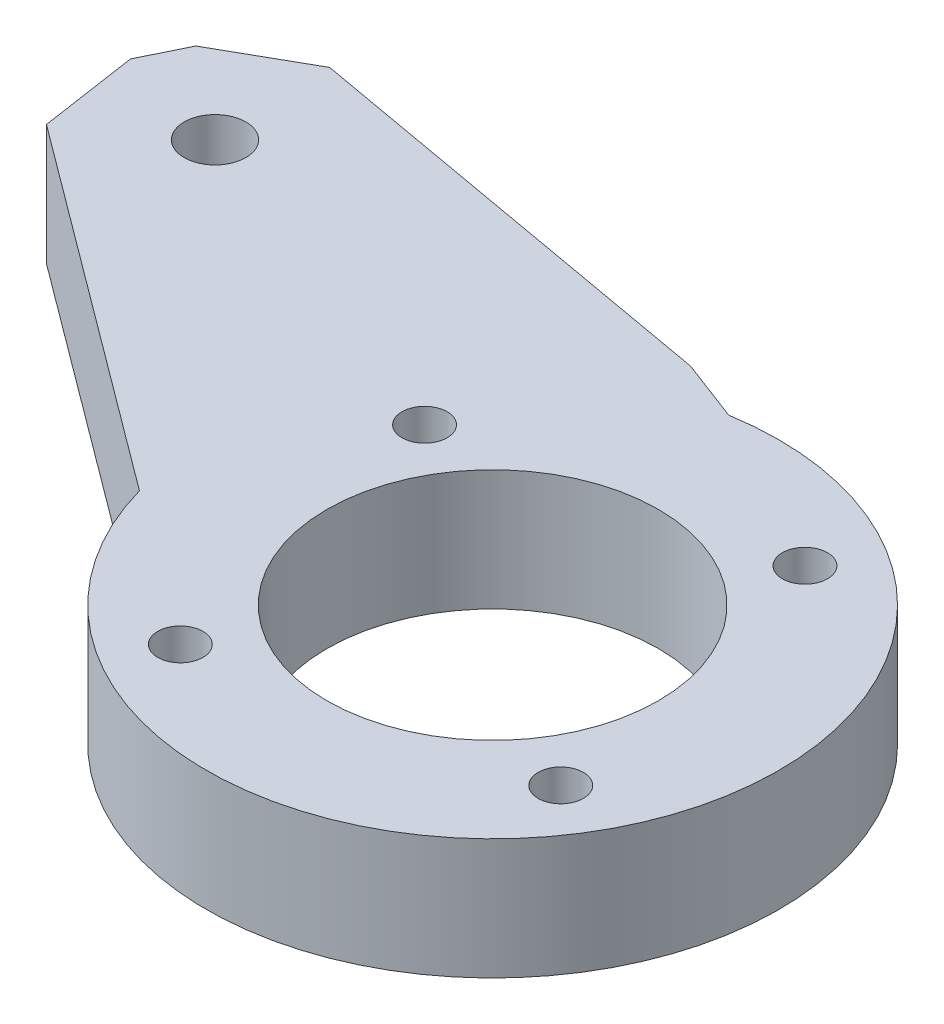
ISO-10303-21;
HEADER;
FILE_DESCRIPTION(('STEP AP214'),'2;1');
FILE_NAME('part.step','',(''),(''),'','','');
FILE_SCHEMA(('AUTOMOTIVE_DESIGN { 1 0 10303 214 1 1 1 1 }'));
ENDSEC;
DATA;
#1=APPLICATION_CONTEXT('core data for automotive mechanical design processes');
#2=APPLICATION_PROTOCOL_DEFINITION('international standard','automotive_design',2000,#1);
#3=PRODUCT_CONTEXT('',#1,'mechanical');
#4=PRODUCT('Part','Part','',(#3));
#5=PRODUCT_RELATED_PRODUCT_CATEGORY('part','',(#4));
#6=PRODUCT_DEFINITION_FORMATION('','',#4);
#7=PRODUCT_DEFINITION_CONTEXT('part definition',#1,'design');
#8=PRODUCT_DEFINITION('design','',#6,#7);
#9=PRODUCT_DEFINITION_SHAPE('','',#8);
#10=(LENGTH_UNIT() NAMED_UNIT(*) SI_UNIT(.MILLI.,.METRE.));
#11=(NAMED_UNIT(*) PLANE_ANGLE_UNIT() SI_UNIT($,.RADIAN.));
#12=(NAMED_UNIT(*) SI_UNIT($,.STERADIAN.) SOLID_ANGLE_UNIT());
#13=UNCERTAINTY_MEASURE_WITH_UNIT(LENGTH_MEASURE(1.E-05),#10,'distance_accuracy_value','');
#14=(GEOMETRIC_REPRESENTATION_CONTEXT(3) GLOBAL_UNCERTAINTY_ASSIGNED_CONTEXT((#13)) GLOBAL_UNIT_ASSIGNED_CONTEXT((#10,
#11,#12)) REPRESENTATION_CONTEXT('',''));
#15=CARTESIAN_POINT('',(0.,0.,0.));
#16=DIRECTION('',(0.,0.,1.));
#17=DIRECTION('',(1.,0.,0.));
#18=AXIS2_PLACEMENT_3D('',#15,#16,#17);
#19=CARTESIAN_POINT('',(-206.266697519,-35.500004703,299.965154128));
#20=DIRECTION('',(0.,-1.,0.));
#21=DIRECTION('',(0.,0.,-1.));
#22=AXIS2_PLACEMENT_3D('',#19,#20,#21);
#23=PLANE('',#22);
#24=CARTESIAN_POINT('',(91.8964328411393,-35.500004703,75.1226612568712));
#25=DIRECTION('',(0.,-1.,0.));
#26=DIRECTION('',(-1.,0.,0.));
#27=AXIS2_PLACEMENT_3D('',#24,#25,#26);
#28=CIRCLE('',#27,1.5);
#29=CARTESIAN_POINT('',(90.3964328411393,-35.500004703,75.1226612568712));
#30=VERTEX_POINT('',#29);
#31=EDGE_CURVE('E393',#30,#30,#28,.T.);
#32=ORIENTED_EDGE('',*,*,#31,.T.);
#33=EDGE_LOOP('',(#32));
#34=FACE_BOUND('',#33,.T.);
#35=CARTESIAN_POINT('',(112.622699640871,-35.500004703,70.6036055428608));
#36=DIRECTION('',(0.,-1.,0.));
#37=DIRECTION('',(0.,0.,1.));
#38=AXIS2_PLACEMENT_3D('',#35,#36,#37);
#39=CIRCLE('',#38,1.5);
#40=CARTESIAN_POINT('',(112.622699640871,-35.500004703,72.1036055428608));
#41=VERTEX_POINT('',#40);
#42=EDGE_CURVE('E396',#41,#41,#39,.T.);
#43=ORIENTED_EDGE('',*,*,#42,.T.);
#44=EDGE_LOOP('',(#43));
#45=FACE_BOUND('',#44,.T.);
#46=CARTESIAN_POINT('',(108.103643926861,-35.500004703,49.8773387431288));
#47=DIRECTION('',(0.,-1.,0.));
#48=DIRECTION('',(1.,0.,0.));
#49=AXIS2_PLACEMENT_3D('',#46,#47,#48);
#50=CIRCLE('',#49,1.5);
#51=CARTESIAN_POINT('',(109.603643926861,-35.500004703,49.8773387431287));
#52=VERTEX_POINT('',#51);
#53=EDGE_CURVE('E406',#52,#52,#50,.T.);
#54=ORIENTED_EDGE('',*,*,#53,.T.);
#55=EDGE_LOOP('',(#54));
#56=FACE_BOUND('',#55,.T.);
#57=CARTESIAN_POINT('',(87.3773771271288,-35.500004703,54.3963944571392));
#58=DIRECTION('',(0.,-1.,0.));
#59=DIRECTION('',(0.,0.,-1.));
#60=AXIS2_PLACEMENT_3D('',#57,#58,#59);
#61=CIRCLE('',#60,1.5);
#62=CARTESIAN_POINT('',(87.3773771271288,-35.500004703,52.8963944571392));
#63=VERTEX_POINT('',#62);
#64=EDGE_CURVE('E291',#63,#63,#61,.T.);
#65=ORIENTED_EDGE('',*,*,#64,.T.);
#66=EDGE_LOOP('',(#65));
#67=FACE_BOUND('',#66,.T.);
#68=CARTESIAN_POINT('',(100.000038384,-35.500004703,62.5));
#69=DIRECTION('',(0.,-1.,0.));
#70=DIRECTION('',(0.,0.,-1.));
#71=AXIS2_PLACEMENT_3D('',#68,#69,#70);
#72=CIRCLE('',#71,11.);
#73=CARTESIAN_POINT('',(100.000038384,-35.500004703,51.5));
#74=VERTEX_POINT('',#73);
#75=EDGE_CURVE('E420',#74,#74,#72,.T.);
#76=ORIENTED_EDGE('',*,*,#75,.T.);
#77=EDGE_LOOP('',(#76));
#78=FACE_BOUND('',#77,.T.);
#79=CARTESIAN_POINT('',(100.000038384,-35.500004703,62.5));
#80=DIRECTION('',(0.,-1.,0.));
#81=DIRECTION('',(0.,0.,-1.));
#82=AXIS2_PLACEMENT_3D('',#79,#80,#81);
#83=CIRCLE('',#82,19.);
#84=CARTESIAN_POINT('',(81.7117133607447,-35.500004703,67.6514238656681));
#85=VERTEX_POINT('',#84);
#86=CARTESIAN_POINT('',(96.9151380438457,-35.500004703,43.7521097215896));
#87=VERTEX_POINT('',#86);
#88=EDGE_CURVE('E416',#85,#87,#83,.F.);
#89=ORIENTED_EDGE('',*,*,#88,.T.);
#90=DIRECTION('',(-0.934785835128812,0.,-0.35521182756565));
#91=VECTOR('',#90,1.);
#92=CARTESIAN_POINT('',(103.586027530498,-35.500004703,46.2869992727514));
#93=LINE('',#92,#91);
#94=CARTESIAN_POINT('',(92.822153420475,-35.500004703,42.1968052939553));
#95=VERTEX_POINT('',#94);
#96=EDGE_CURVE('E298',#87,#95,#93,.T.);
#97=ORIENTED_EDGE('',*,*,#96,.T.);
#98=DIRECTION('',(-0.984514503788386,0.,-0.17530314267094));
#99=VECTOR('',#98,1.);
#100=CARTESIAN_POINT('',(92.822153420475,-35.500004703,42.1968052939553));
#101=LINE('',#100,#99);
#102=CARTESIAN_POINT('',(63.6897348581457,-35.500004703,37.0094723415916));
#103=VERTEX_POINT('',#102);
#104=EDGE_CURVE('E330',#95,#103,#101,.T.);
#105=ORIENTED_EDGE('',*,*,#104,.T.);
#106=DIRECTION('',(-0.870211440463982,0.,0.492678443698931));
#107=VECTOR('',#106,1.);
#108=CARTESIAN_POINT('',(63.6897348581457,-35.500004703,37.0094723415916));
#109=LINE('',#108,#107);
#110=CARTESIAN_POINT('',(58.0177872912911,-35.500004703,40.2206991423907));
#111=VERTEX_POINT('',#110);
#112=EDGE_CURVE('E322',#103,#111,#109,.T.);
#113=ORIENTED_EDGE('',*,*,#112,.T.);
#114=DIRECTION('',(-0.438371147077342,0.,0.898794046158571));
#115=VECTOR('',#114,1.);
#116=CARTESIAN_POINT('',(58.0177872912911,-35.500004703,40.2206991423907));
#117=LINE('',#116,#115);
#118=CARTESIAN_POINT('',(56.5968550797981,-35.500004703,43.134041911867));
#119=VERTEX_POINT('',#118);
#120=EDGE_CURVE('E434',#111,#119,#117,.T.);
#121=ORIENTED_EDGE('',*,*,#120,.T.);
#122=DIRECTION('',(0.147519747511098,0.,0.989059110515778));
#123=VECTOR('',#122,1.);
#124=CARTESIAN_POINT('',(56.5968550797981,-35.500004703,43.134041911867));
#125=LINE('',#124,#123);
#126=CARTESIAN_POINT('',(57.5738866518634,-35.500004703,49.6846359436255));
#127=VERTEX_POINT('',#126);
#128=EDGE_CURVE('E431',#119,#127,#125,.T.);
#129=ORIENTED_EDGE('',*,*,#128,.T.);
#130=DIRECTION('',(0.802173464510192,0.,0.597091059082043));
#131=VECTOR('',#130,1.);
#132=CARTESIAN_POINT('',(57.5738866518634,-35.500004703,49.6846359436255));
#133=LINE('',#132,#131);
#134=EDGE_CURVE('E428',#127,#85,#133,.T.);
#135=ORIENTED_EDGE('',*,*,#134,.T.);
#136=EDGE_LOOP('',(#89,#97,#105,#113,#121,#129,#135));
#137=FACE_BOUND('',#136,.T.);
#138=CARTESIAN_POINT('',(64.046053168,-35.500004703,44.969712702));
#139=DIRECTION('',(0.,-1.,0.));
#140=DIRECTION('',(0.,0.,-1.));
#141=AXIS2_PLACEMENT_3D('',#138,#139,#140);
#142=CIRCLE('',#141,2.05);
#143=CARTESIAN_POINT('',(64.046053168,-35.500004703,42.919712702));
#144=VERTEX_POINT('',#143);
#145=CARTESIAN_POINT('',(61.996053168,-35.500004703,44.969712702));
#146=VERTEX_POINT('',#145);
#147=EDGE_CURVE('E329',#144,#146,#142,.T.);
#148=ORIENTED_EDGE('',*,*,#147,.T.);
#149=CARTESIAN_POINT('',(64.046053168,-35.500004703,44.969712702));
#150=DIRECTION('',(0.,-1.,0.));
#151=DIRECTION('',(0.,0.,-1.));
#152=AXIS2_PLACEMENT_3D('',#149,#150,#151);
#153=CIRCLE('',#152,2.05);
#154=EDGE_CURVE('E231',#146,#144,#153,.T.);
#155=ORIENTED_EDGE('',*,*,#154,.T.);
#156=EDGE_LOOP('',(#148,#155));
#157=FACE_BOUND('',#156,.T.);
#158=ADVANCED_FACE('F212',(#34,#45,#56,#67,#78,#137,#157),#23,.F.);
#159=CARTESIAN_POINT('',(-206.266697519,-43.500004703,299.965154128));
#160=DIRECTION('',(0.,-1.,0.));
#161=DIRECTION('',(0.,0.,-1.));
#162=AXIS2_PLACEMENT_3D('',#159,#160,#161);
#163=PLANE('',#162);
#164=CARTESIAN_POINT('',(91.8964328411393,-43.500004703,75.1226612568712));
#165=DIRECTION('',(0.,-1.,0.));
#166=DIRECTION('',(-1.,0.,0.));
#167=AXIS2_PLACEMENT_3D('',#164,#165,#166);
#168=CIRCLE('',#167,1.5);
#169=CARTESIAN_POINT('',(90.3964328411393,-43.500004703,75.1226612568712));
#170=VERTEX_POINT('',#169);
#171=EDGE_CURVE('E395',#170,#170,#168,.T.);
#172=ORIENTED_EDGE('',*,*,#171,.F.);
#173=EDGE_LOOP('',(#172));
#174=FACE_BOUND('',#173,.T.);
#175=CARTESIAN_POINT('',(112.622699640871,-43.500004703,70.6036055428608));
#176=DIRECTION('',(0.,-1.,0.));
#177=DIRECTION('',(0.,0.,1.));
#178=AXIS2_PLACEMENT_3D('',#175,#176,#177);
#179=CIRCLE('',#178,1.5);
#180=CARTESIAN_POINT('',(112.622699640871,-43.500004703,72.1036055428608));
#181=VERTEX_POINT('',#180);
#182=EDGE_CURVE('E401',#181,#181,#179,.T.);
#183=ORIENTED_EDGE('',*,*,#182,.F.);
#184=EDGE_LOOP('',(#183));
#185=FACE_BOUND('',#184,.T.);
#186=CARTESIAN_POINT('',(108.103643926861,-43.500004703,49.8773387431288));
#187=DIRECTION('',(0.,-1.,0.));
#188=DIRECTION('',(1.,0.,0.));
#189=AXIS2_PLACEMENT_3D('',#186,#187,#188);
#190=CIRCLE('',#189,1.5);
#191=CARTESIAN_POINT('',(109.603643926861,-43.500004703,49.8773387431287));
#192=VERTEX_POINT('',#191);
#193=EDGE_CURVE('E409',#192,#192,#190,.T.);
#194=ORIENTED_EDGE('',*,*,#193,.F.);
#195=EDGE_LOOP('',(#194));
#196=FACE_BOUND('',#195,.T.);
#197=CARTESIAN_POINT('',(87.3773771271288,-43.500004703,54.3963944571392));
#198=DIRECTION('',(0.,-1.,0.));
#199=DIRECTION('',(0.,0.,-1.));
#200=AXIS2_PLACEMENT_3D('',#197,#198,#199);
#201=CIRCLE('',#200,1.5);
#202=CARTESIAN_POINT('',(87.3773771271288,-43.500004703,52.8963944571392));
#203=VERTEX_POINT('',#202);
#204=EDGE_CURVE('E398',#203,#203,#201,.T.);
#205=ORIENTED_EDGE('',*,*,#204,.F.);
#206=EDGE_LOOP('',(#205));
#207=FACE_BOUND('',#206,.T.);
#208=CARTESIAN_POINT('',(100.000038384,-43.500004703,62.5));
#209=DIRECTION('',(0.,-1.,0.));
#210=DIRECTION('',(0.,0.,-1.));
#211=AXIS2_PLACEMENT_3D('',#208,#209,#210);
#212=CIRCLE('',#211,11.);
#213=CARTESIAN_POINT('',(100.000038384,-43.500004703,51.5));
#214=VERTEX_POINT('',#213);
#215=EDGE_CURVE('E419',#214,#214,#212,.T.);
#216=ORIENTED_EDGE('',*,*,#215,.F.);
#217=EDGE_LOOP('',(#216));
#218=FACE_BOUND('',#217,.T.);
#219=DIRECTION('',(-0.934785835128812,0.,-0.35521182756565));
#220=VECTOR('',#219,1.);
#221=CARTESIAN_POINT('',(103.586027530498,-43.500004703,46.2869992727514));
#222=LINE('',#221,#220);
#223=CARTESIAN_POINT('',(96.9151380438457,-43.500004703,43.7521097215896));
#224=VERTEX_POINT('',#223);
#225=CARTESIAN_POINT('',(92.822153420475,-43.500004703,42.1968052939553));
#226=VERTEX_POINT('',#225);
#227=EDGE_CURVE('E296',#224,#226,#222,.T.);
#228=ORIENTED_EDGE('',*,*,#227,.F.);
#229=CARTESIAN_POINT('',(100.000038384,-43.500004703,62.5));
#230=DIRECTION('',(0.,-1.,0.));
#231=DIRECTION('',(0.,0.,-1.));
#232=AXIS2_PLACEMENT_3D('',#229,#230,#231);
#233=CIRCLE('',#232,19.);
#234=CARTESIAN_POINT('',(81.7117133607447,-43.500004703,67.6514238656681));
#235=VERTEX_POINT('',#234);
#236=EDGE_CURVE('E281',#224,#235,#233,.T.);
#237=ORIENTED_EDGE('',*,*,#236,.T.);
#238=DIRECTION('',(0.802173464510192,0.,0.597091059082043));
#239=VECTOR('',#238,1.);
#240=CARTESIAN_POINT('',(57.5738866518634,-43.500004703,49.6846359436255));
#241=LINE('',#240,#239);
#242=CARTESIAN_POINT('',(57.5738866518634,-43.500004703,49.6846359436255));
#243=VERTEX_POINT('',#242);
#244=EDGE_CURVE('E307',#243,#235,#241,.T.);
#245=ORIENTED_EDGE('',*,*,#244,.F.);
#246=DIRECTION('',(0.147519747511098,0.,0.989059110515778));
#247=VECTOR('',#246,1.);
#248=CARTESIAN_POINT('',(56.5968550797981,-43.500004703,43.134041911867));
#249=LINE('',#248,#247);
#250=CARTESIAN_POINT('',(56.5968550797981,-43.500004703,43.134041911867));
#251=VERTEX_POINT('',#250);
#252=EDGE_CURVE('E314',#251,#243,#249,.T.);
#253=ORIENTED_EDGE('',*,*,#252,.F.);
#254=DIRECTION('',(-0.438371147077342,0.,0.898794046158571));
#255=VECTOR('',#254,1.);
#256=CARTESIAN_POINT('',(58.0177872912911,-43.500004703,40.2206991423907));
#257=LINE('',#256,#255);
#258=CARTESIAN_POINT('',(58.0177872912911,-43.500004703,40.2206991423907));
#259=VERTEX_POINT('',#258);
#260=EDGE_CURVE('E319',#259,#251,#257,.T.);
#261=ORIENTED_EDGE('',*,*,#260,.F.);
#262=DIRECTION('',(-0.870211440463982,0.,0.492678443698932));
#263=VECTOR('',#262,1.);
#264=CARTESIAN_POINT('',(63.6897348581457,-43.500004703,37.0094723415916));
#265=LINE('',#264,#263);
#266=CARTESIAN_POINT('',(63.6897348581457,-43.500004703,37.0094723415916));
#267=VERTEX_POINT('',#266);
#268=EDGE_CURVE('E325',#267,#259,#265,.T.);
#269=ORIENTED_EDGE('',*,*,#268,.F.);
#270=DIRECTION('',(-0.984514503788386,0.,-0.17530314267094));
#271=VECTOR('',#270,1.);
#272=CARTESIAN_POINT('',(92.822153420475,-43.500004703,42.1968052939553));
#273=LINE('',#272,#271);
#274=EDGE_CURVE('E302',#226,#267,#273,.T.);
#275=ORIENTED_EDGE('',*,*,#274,.F.);
#276=EDGE_LOOP('',(#228,#237,#245,#253,#261,#269,#275));
#277=FACE_BOUND('',#276,.T.);
#278=CARTESIAN_POINT('',(64.046053168,-43.500004703,44.969712702));
#279=DIRECTION('',(0.,-1.,0.));
#280=DIRECTION('',(0.,0.,-1.));
#281=AXIS2_PLACEMENT_3D('',#278,#279,#280);
#282=CIRCLE('',#281,2.05);
#283=CARTESIAN_POINT('',(61.996053168,-43.500004703,44.969712702));
#284=VERTEX_POINT('',#283);
#285=CARTESIAN_POINT('',(64.046053168,-43.500004703,42.919712702));
#286=VERTEX_POINT('',#285);
#287=EDGE_CURVE('E216',#284,#286,#282,.T.);
#288=ORIENTED_EDGE('',*,*,#287,.F.);
#289=CARTESIAN_POINT('',(64.046053168,-43.500004703,44.969712702));
#290=DIRECTION('',(0.,-1.,0.));
#291=DIRECTION('',(0.,0.,-1.));
#292=AXIS2_PLACEMENT_3D('',#289,#290,#291);
#293=CIRCLE('',#292,2.05);
#294=EDGE_CURVE('E12',#286,#284,#293,.T.);
#295=ORIENTED_EDGE('',*,*,#294,.F.);
#296=EDGE_LOOP('',(#288,#295));
#297=FACE_BOUND('',#296,.T.);
#298=ADVANCED_FACE('F300',(#174,#185,#196,#207,#218,#277,#297),#163,.T.);
#299=CARTESIAN_POINT('',(64.046053168,-41.500004703,44.969712702));
#300=DIRECTION('',(0.,1.,0.));
#301=DIRECTION('',(-1.,0.,0.));
#302=AXIS2_PLACEMENT_3D('',#299,#300,#301);
#303=CYLINDRICAL_SURFACE('',#302,2.05);
#304=DIRECTION('',(0.,-1.,0.));
#305=VECTOR('',#304,1.);
#306=CARTESIAN_POINT('',(61.996053168,-35.500004703,44.969712702));
#307=LINE('',#306,#305);
#308=EDGE_CURVE('E326',#146,#284,#307,.T.);
#309=ORIENTED_EDGE('',*,*,#308,.F.);
#310=ORIENTED_EDGE('',*,*,#147,.F.);
#311=ORIENTED_EDGE('',*,*,#154,.F.);
#312=ORIENTED_EDGE('',*,*,#308,.T.);
#313=ORIENTED_EDGE('',*,*,#287,.T.);
#314=ORIENTED_EDGE('',*,*,#294,.T.);
#315=EDGE_LOOP('',(#309,#310,#311,#312,#313,#314));
#316=FACE_BOUND('',#315,.T.);
#317=ADVANCED_FACE('F214',(#316),#303,.F.);
#318=CARTESIAN_POINT('',(63.6897348581457,-116.6486020619,37.0094723415916));
#319=DIRECTION('',(-0.492678443698932,0.,-0.870211440463982));
#320=DIRECTION('',(-0.870211440463982,0.,0.492678443698932));
#321=AXIS2_PLACEMENT_3D('',#318,#319,#320);
#322=PLANE('',#321);
#323=DIRECTION('',(0.,1.,0.));
#324=VECTOR('',#323,1.);
#325=CARTESIAN_POINT('',(63.6897348581457,-116.6486020619,37.0094723415916));
#326=LINE('',#325,#324);
#327=EDGE_CURVE('E305',#267,#103,#326,.T.);
#328=ORIENTED_EDGE('',*,*,#327,.F.);
#329=ORIENTED_EDGE('',*,*,#268,.T.);
#330=DIRECTION('',(0.,1.,0.));
#331=VECTOR('',#330,1.);
#332=CARTESIAN_POINT('',(58.0177872912911,-116.6486020619,40.2206991423907));
#333=LINE('',#332,#331);
#334=EDGE_CURVE('E323',#259,#111,#333,.T.);
#335=ORIENTED_EDGE('',*,*,#334,.T.);
#336=ORIENTED_EDGE('',*,*,#112,.F.);
#337=EDGE_LOOP('',(#328,#329,#335,#336));
#338=FACE_BOUND('',#337,.T.);
#339=ADVANCED_FACE('F340',(#338),#322,.T.);
#340=CARTESIAN_POINT('',(92.822153420475,-116.6486020619,42.1968052939553));
#341=DIRECTION('',(0.17530314267094,0.,-0.984514503788386));
#342=DIRECTION('',(-0.984514503788386,0.,-0.17530314267094));
#343=AXIS2_PLACEMENT_3D('',#340,#341,#342);
#344=PLANE('',#343);
#345=DIRECTION('',(0.,1.,0.));
#346=VECTOR('',#345,1.);
#347=CARTESIAN_POINT('',(92.822153420475,-116.6486020619,42.1968052939553));
#348=LINE('',#347,#346);
#349=EDGE_CURVE('E304',#226,#95,#348,.T.);
#350=ORIENTED_EDGE('',*,*,#349,.F.);
#351=ORIENTED_EDGE('',*,*,#274,.T.);
#352=ORIENTED_EDGE('',*,*,#327,.T.);
#353=ORIENTED_EDGE('',*,*,#104,.F.);
#354=EDGE_LOOP('',(#350,#351,#352,#353));
#355=FACE_BOUND('',#354,.T.);
#356=ADVANCED_FACE('F348',(#355),#344,.T.);
#357=CARTESIAN_POINT('',(103.586027530498,-116.6486020619,46.2869992727514));
#358=DIRECTION('',(0.35521182756565,0.,-0.934785835128812));
#359=DIRECTION('',(-0.934785835128812,0.,-0.35521182756565));
#360=AXIS2_PLACEMENT_3D('',#357,#358,#359);
#361=PLANE('',#360);
#362=DIRECTION('',(0.,-1.,0.));
#363=VECTOR('',#362,1.);
#364=CARTESIAN_POINT('',(96.9151380438457,17.7392588441221,43.7521097215896));
#365=LINE('',#364,#363);
#366=EDGE_CURVE('E284',#87,#224,#365,.T.);
#367=ORIENTED_EDGE('',*,*,#366,.T.);
#368=ORIENTED_EDGE('',*,*,#227,.T.);
#369=ORIENTED_EDGE('',*,*,#349,.T.);
#370=ORIENTED_EDGE('',*,*,#96,.F.);
#371=EDGE_LOOP('',(#367,#368,#369,#370));
#372=FACE_BOUND('',#371,.T.);
#373=ADVANCED_FACE('F294',(#372),#361,.T.);
#374=CARTESIAN_POINT('',(57.5738866518634,-116.6486020619,49.6846359436255));
#375=DIRECTION('',(-0.597091059082043,0.,0.802173464510192));
#376=DIRECTION('',(0.802173464510192,0.,0.597091059082043));
#377=AXIS2_PLACEMENT_3D('',#374,#375,#376);
#378=PLANE('',#377);
#379=DIRECTION('',(0.,-1.,0.));
#380=VECTOR('',#379,1.);
#381=CARTESIAN_POINT('',(81.7117133607447,17.7392588441221,67.6514238656681));
#382=LINE('',#381,#380);
#383=EDGE_CURVE('E287',#85,#235,#382,.T.);
#384=ORIENTED_EDGE('',*,*,#383,.F.);
#385=ORIENTED_EDGE('',*,*,#134,.F.);
#386=DIRECTION('',(0.,1.,0.));
#387=VECTOR('',#386,1.);
#388=CARTESIAN_POINT('',(57.5738866518634,-116.6486020619,49.6846359436255));
#389=LINE('',#388,#387);
#390=EDGE_CURVE('E316',#243,#127,#389,.T.);
#391=ORIENTED_EDGE('',*,*,#390,.F.);
#392=ORIENTED_EDGE('',*,*,#244,.T.);
#393=EDGE_LOOP('',(#384,#385,#391,#392));
#394=FACE_BOUND('',#393,.T.);
#395=ADVANCED_FACE('F355',(#394),#378,.T.);
#396=CARTESIAN_POINT('',(56.5968550797981,-116.6486020619,43.134041911867));
#397=DIRECTION('',(-0.989059110515778,0.,0.147519747511098));
#398=DIRECTION('',(0.147519747511098,0.,0.989059110515778));
#399=AXIS2_PLACEMENT_3D('',#396,#397,#398);
#400=PLANE('',#399);
#401=DIRECTION('',(0.,1.,0.));
#402=VECTOR('',#401,1.);
#403=CARTESIAN_POINT('',(56.5968550797981,-116.6486020619,43.134041911867));
#404=LINE('',#403,#402);
#405=EDGE_CURVE('E320',#251,#119,#404,.T.);
#406=ORIENTED_EDGE('',*,*,#405,.F.);
#407=ORIENTED_EDGE('',*,*,#252,.T.);
#408=ORIENTED_EDGE('',*,*,#390,.T.);
#409=ORIENTED_EDGE('',*,*,#128,.F.);
#410=EDGE_LOOP('',(#406,#407,#408,#409));
#411=FACE_BOUND('',#410,.T.);
#412=ADVANCED_FACE('F358',(#411),#400,.T.);
#413=CARTESIAN_POINT('',(58.0177872912911,-116.6486020619,40.2206991423907));
#414=DIRECTION('',(-0.898794046158571,0.,-0.438371147077342));
#415=DIRECTION('',(-0.438371147077342,0.,0.898794046158571));
#416=AXIS2_PLACEMENT_3D('',#413,#414,#415);
#417=PLANE('',#416);
#418=ORIENTED_EDGE('',*,*,#334,.F.);
#419=ORIENTED_EDGE('',*,*,#260,.T.);
#420=ORIENTED_EDGE('',*,*,#405,.T.);
#421=ORIENTED_EDGE('',*,*,#120,.F.);
#422=EDGE_LOOP('',(#418,#419,#420,#421));
#423=FACE_BOUND('',#422,.T.);
#424=ADVANCED_FACE('F362',(#423),#417,.T.);
#425=CARTESIAN_POINT('',(100.000038384,-35.500004703,62.5));
#426=DIRECTION('',(0.,-1.,0.));
#427=DIRECTION('',(0.,0.,-1.));
#428=AXIS2_PLACEMENT_3D('',#425,#426,#427);
#429=CYLINDRICAL_SURFACE('',#428,11.);
#430=ORIENTED_EDGE('',*,*,#75,.F.);
#431=EDGE_LOOP('',(#430));
#432=FACE_BOUND('',#431,.T.);
#433=ORIENTED_EDGE('',*,*,#215,.T.);
#434=EDGE_LOOP('',(#433));
#435=FACE_BOUND('',#434,.T.);
#436=ADVANCED_FACE('F366',(#432,#435),#429,.F.);
#437=CARTESIAN_POINT('',(100.000038384,17.7392588441221,62.5));
#438=DIRECTION('',(0.,-1.,0.));
#439=DIRECTION('',(0.,0.,-1.));
#440=AXIS2_PLACEMENT_3D('',#437,#438,#439);
#441=CYLINDRICAL_SURFACE('',#440,19.);
#442=ORIENTED_EDGE('',*,*,#88,.F.);
#443=ORIENTED_EDGE('',*,*,#383,.T.);
#444=ORIENTED_EDGE('',*,*,#236,.F.);
#445=ORIENTED_EDGE('',*,*,#366,.F.);
#446=EDGE_LOOP('',(#442,#443,#444,#445));
#447=FACE_BOUND('',#446,.T.);
#448=ADVANCED_FACE('F283',(#447),#441,.T.);
#449=CARTESIAN_POINT('',(87.3773771271288,-35.500004703,54.3963944571392));
#450=DIRECTION('',(0.,-1.,0.));
#451=DIRECTION('',(0.,0.,-1.));
#452=AXIS2_PLACEMENT_3D('',#449,#450,#451);
#453=CYLINDRICAL_SURFACE('',#452,1.5);
#454=ORIENTED_EDGE('',*,*,#64,.F.);
#455=EDGE_LOOP('',(#454));
#456=FACE_BOUND('',#455,.T.);
#457=ORIENTED_EDGE('',*,*,#204,.T.);
#458=EDGE_LOOP('',(#457));
#459=FACE_BOUND('',#458,.T.);
#460=ADVANCED_FACE('F373',(#456,#459),#453,.F.);
#461=CARTESIAN_POINT('',(108.103643926861,-35.500004703,49.8773387431288));
#462=DIRECTION('',(0.,-1.,0.));
#463=DIRECTION('',(0.,0.,-1.));
#464=AXIS2_PLACEMENT_3D('',#461,#462,#463);
#465=CYLINDRICAL_SURFACE('',#464,1.5);
#466=ORIENTED_EDGE('',*,*,#53,.F.);
#467=EDGE_LOOP('',(#466));
#468=FACE_BOUND('',#467,.T.);
#469=ORIENTED_EDGE('',*,*,#193,.T.);
#470=EDGE_LOOP('',(#469));
#471=FACE_BOUND('',#470,.T.);
#472=ADVANCED_FACE('F376',(#468,#471),#465,.F.);
#473=CARTESIAN_POINT('',(112.622699640871,-35.500004703,70.6036055428608));
#474=DIRECTION('',(0.,-1.,0.));
#475=DIRECTION('',(0.,0.,-1.));
#476=AXIS2_PLACEMENT_3D('',#473,#474,#475);
#477=CYLINDRICAL_SURFACE('',#476,1.5);
#478=ORIENTED_EDGE('',*,*,#42,.F.);
#479=EDGE_LOOP('',(#478));
#480=FACE_BOUND('',#479,.T.);
#481=ORIENTED_EDGE('',*,*,#182,.T.);
#482=EDGE_LOOP('',(#481));
#483=FACE_BOUND('',#482,.T.);
#484=ADVANCED_FACE('F380',(#480,#483),#477,.F.);
#485=CARTESIAN_POINT('',(91.8964328411393,-35.500004703,75.1226612568712));
#486=DIRECTION('',(0.,-1.,0.));
#487=DIRECTION('',(0.,0.,-1.));
#488=AXIS2_PLACEMENT_3D('',#485,#486,#487);
#489=CYLINDRICAL_SURFACE('',#488,1.5);
#490=ORIENTED_EDGE('',*,*,#31,.F.);
#491=EDGE_LOOP('',(#490));
#492=FACE_BOUND('',#491,.T.);
#493=ORIENTED_EDGE('',*,*,#171,.T.);
#494=EDGE_LOOP('',(#493));
#495=FACE_BOUND('',#494,.T.);
#496=ADVANCED_FACE('F384',(#492,#495),#489,.F.);
#497=CLOSED_SHELL('',(#158,#298,#317,#339,#356,#373,#395,#412,#424,#436,#448,#460,#472,#484,#496));
#498=MANIFOLD_SOLID_BREP('B2',#497);
#499=ADVANCED_BREP_SHAPE_REPRESENTATION('',(#18,#498),#14);
#500=SHAPE_DEFINITION_REPRESENTATION(#9,#499);
ENDSEC;
END-ISO-10303-21;
